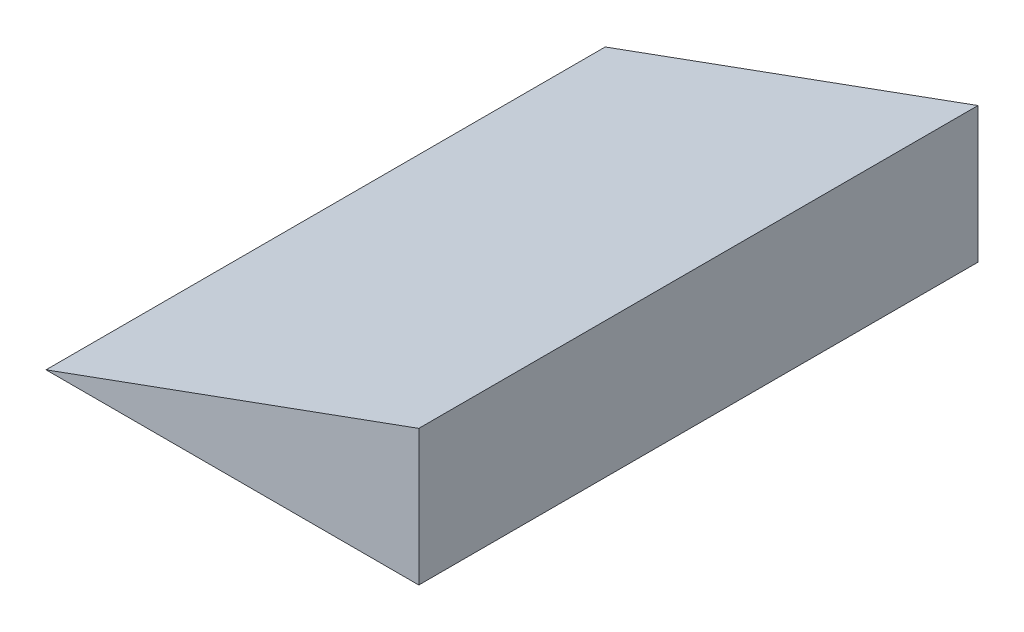
ISO-10303-21;
HEADER;
FILE_DESCRIPTION(('STEP AP214'),'2;1');
FILE_NAME('part.step','',(''),(''),'','','');
FILE_SCHEMA(('AUTOMOTIVE_DESIGN { 1 0 10303 214 1 1 1 1 }'));
ENDSEC;
DATA;
#1=APPLICATION_CONTEXT('core data for automotive mechanical design processes');
#2=APPLICATION_PROTOCOL_DEFINITION('international standard','automotive_design',2000,#1);
#3=PRODUCT_CONTEXT('',#1,'mechanical');
#4=PRODUCT('Part','Part','',(#3));
#5=PRODUCT_RELATED_PRODUCT_CATEGORY('part','',(#4));
#6=PRODUCT_DEFINITION_FORMATION('','',#4);
#7=PRODUCT_DEFINITION_CONTEXT('part definition',#1,'design');
#8=PRODUCT_DEFINITION('design','',#6,#7);
#9=PRODUCT_DEFINITION_SHAPE('','',#8);
#10=(LENGTH_UNIT() NAMED_UNIT(*) SI_UNIT(.MILLI.,.METRE.));
#11=(NAMED_UNIT(*) PLANE_ANGLE_UNIT() SI_UNIT($,.RADIAN.));
#12=(NAMED_UNIT(*) SI_UNIT($,.STERADIAN.) SOLID_ANGLE_UNIT());
#13=UNCERTAINTY_MEASURE_WITH_UNIT(LENGTH_MEASURE(1.E-05),#10,'distance_accuracy_value','');
#14=(GEOMETRIC_REPRESENTATION_CONTEXT(3) GLOBAL_UNCERTAINTY_ASSIGNED_CONTEXT((#13)) GLOBAL_UNIT_ASSIGNED_CONTEXT((#10,
#11,#12)) REPRESENTATION_CONTEXT('',''));
#15=CARTESIAN_POINT('',(0.,0.,0.));
#16=DIRECTION('',(0.,0.,1.));
#17=DIRECTION('',(1.,0.,0.));
#18=AXIS2_PLACEMENT_3D('',#15,#16,#17);
#19=CARTESIAN_POINT('',(2000.,1455.88093706481,6000.));
#20=DIRECTION('',(-1.,0.,0.));
#21=DIRECTION('',(0.,-1.,0.));
#22=AXIS2_PLACEMENT_3D('',#19,#20,#21);
#23=PLANE('',#22);
#24=DIRECTION('',(0.,1.,0.));
#25=VECTOR('',#24,1.);
#26=CARTESIAN_POINT('',(2000.,1455.88093706481,0.));
#27=LINE('',#26,#25);
#28=CARTESIAN_POINT('',(2000.,7.34788079488412E-13,0.));
#29=VERTEX_POINT('',#28);
#30=CARTESIAN_POINT('',(2000.,1455.88093706481,0.));
#31=VERTEX_POINT('',#30);
#32=EDGE_CURVE('E89',#29,#31,#27,.T.);
#33=ORIENTED_EDGE('',*,*,#32,.T.);
#34=DIRECTION('',(0.,0.,-1.));
#35=VECTOR('',#34,1.);
#36=CARTESIAN_POINT('',(2000.,1455.88093706481,6000.));
#37=LINE('',#36,#35);
#38=CARTESIAN_POINT('',(2000.,1455.88093706481,6000.));
#39=VERTEX_POINT('',#38);
#40=EDGE_CURVE('E11',#39,#31,#37,.T.);
#41=ORIENTED_EDGE('',*,*,#40,.F.);
#42=DIRECTION('',(0.,1.,0.));
#43=VECTOR('',#42,1.);
#44=CARTESIAN_POINT('',(2000.,1455.88093706481,6000.));
#45=LINE('',#44,#43);
#46=CARTESIAN_POINT('',(2000.,7.34788079488412E-13,6000.));
#47=VERTEX_POINT('',#46);
#48=EDGE_CURVE('E81',#47,#39,#45,.T.);
#49=ORIENTED_EDGE('',*,*,#48,.F.);
#50=DIRECTION('',(0.,0.,-1.));
#51=VECTOR('',#50,1.);
#52=CARTESIAN_POINT('',(2000.,7.34788079488412E-13,6000.));
#53=LINE('',#52,#51);
#54=EDGE_CURVE('E90',#47,#29,#53,.T.);
#55=ORIENTED_EDGE('',*,*,#54,.T.);
#56=EDGE_LOOP('',(#33,#41,#49,#55));
#57=FACE_BOUND('',#56,.T.);
#58=ADVANCED_FACE('F39',(#57),#23,.F.);
#59=CARTESIAN_POINT('',(-2000.,0.,6000.));
#60=DIRECTION('',(0.34202014332567,-0.939692620785908,0.));
#61=DIRECTION('',(0.939692620785908,0.34202014332567,0.));
#62=AXIS2_PLACEMENT_3D('',#59,#60,#61);
#63=PLANE('',#62);
#64=DIRECTION('',(-0.939692620785908,-0.34202014332567,0.));
#65=VECTOR('',#64,1.);
#66=CARTESIAN_POINT('',(-2000.,0.,0.));
#67=LINE('',#66,#65);
#68=CARTESIAN_POINT('',(-2000.,0.,0.));
#69=VERTEX_POINT('',#68);
#70=EDGE_CURVE('E68',#31,#69,#67,.T.);
#71=ORIENTED_EDGE('',*,*,#70,.T.);
#72=DIRECTION('',(0.,0.,-1.));
#73=VECTOR('',#72,1.);
#74=CARTESIAN_POINT('',(-2000.,0.,6000.));
#75=LINE('',#74,#73);
#76=CARTESIAN_POINT('',(-2000.,0.,6000.));
#77=VERTEX_POINT('',#76);
#78=EDGE_CURVE('E48',#77,#69,#75,.T.);
#79=ORIENTED_EDGE('',*,*,#78,.F.);
#80=DIRECTION('',(-0.939692620785908,-0.34202014332567,0.));
#81=VECTOR('',#80,1.);
#82=CARTESIAN_POINT('',(-2000.,0.,6000.));
#83=LINE('',#82,#81);
#84=EDGE_CURVE('E76',#39,#77,#83,.T.);
#85=ORIENTED_EDGE('',*,*,#84,.F.);
#86=ORIENTED_EDGE('',*,*,#40,.T.);
#87=EDGE_LOOP('',(#71,#79,#85,#86));
#88=FACE_BOUND('',#87,.T.);
#89=ADVANCED_FACE('F77',(#88),#63,.F.);
#90=CARTESIAN_POINT('',(-2000.,0.,6000.));
#91=DIRECTION('',(0.,1.,0.));
#92=DIRECTION('',(-1.,0.,0.));
#93=AXIS2_PLACEMENT_3D('',#90,#91,#92);
#94=PLANE('',#93);
#95=DIRECTION('',(1.,0.,0.));
#96=VECTOR('',#95,1.);
#97=CARTESIAN_POINT('',(-2000.,0.,0.));
#98=LINE('',#97,#96);
#99=EDGE_CURVE('E73',#69,#29,#98,.T.);
#100=ORIENTED_EDGE('',*,*,#99,.T.);
#101=ORIENTED_EDGE('',*,*,#54,.F.);
#102=DIRECTION('',(1.,0.,0.));
#103=VECTOR('',#102,1.);
#104=CARTESIAN_POINT('',(-2000.,0.,6000.));
#105=LINE('',#104,#103);
#106=EDGE_CURVE('E56',#77,#47,#105,.T.);
#107=ORIENTED_EDGE('',*,*,#106,.F.);
#108=ORIENTED_EDGE('',*,*,#78,.T.);
#109=EDGE_LOOP('',(#100,#101,#107,#108));
#110=FACE_BOUND('',#109,.T.);
#111=ADVANCED_FACE('F102',(#110),#94,.F.);
#112=CARTESIAN_POINT('',(0.,0.,6000.));
#113=DIRECTION('',(0.,0.,1.));
#114=DIRECTION('',(1.,0.,0.));
#115=AXIS2_PLACEMENT_3D('',#112,#113,#114);
#116=PLANE('',#115);
#117=ORIENTED_EDGE('',*,*,#48,.T.);
#118=ORIENTED_EDGE('',*,*,#84,.T.);
#119=ORIENTED_EDGE('',*,*,#106,.T.);
#120=EDGE_LOOP('',(#117,#118,#119));
#121=FACE_BOUND('',#120,.T.);
#122=ADVANCED_FACE('F84',(#121),#116,.T.);
#123=CARTESIAN_POINT('',(0.,0.,0.));
#124=DIRECTION('',(0.,0.,1.));
#125=DIRECTION('',(1.,0.,0.));
#126=AXIS2_PLACEMENT_3D('',#123,#124,#125);
#127=PLANE('',#126);
#128=ORIENTED_EDGE('',*,*,#32,.F.);
#129=ORIENTED_EDGE('',*,*,#99,.F.);
#130=ORIENTED_EDGE('',*,*,#70,.F.);
#131=EDGE_LOOP('',(#128,#129,#130));
#132=FACE_BOUND('',#131,.T.);
#133=ADVANCED_FACE('F103',(#132),#127,.F.);
#134=CLOSED_SHELL('',(#58,#89,#111,#122,#133));
#135=MANIFOLD_SOLID_BREP('B2',#134);
#136=ADVANCED_BREP_SHAPE_REPRESENTATION('',(#18,#135),#14);
#137=SHAPE_DEFINITION_REPRESENTATION(#9,#136);
ENDSEC;
END-ISO-10303-21;
